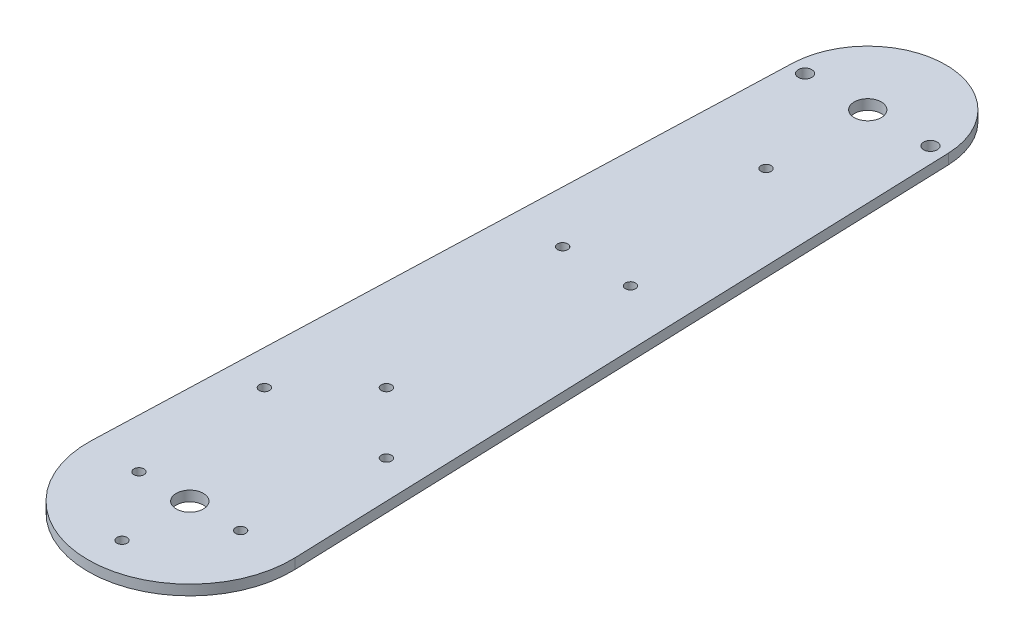
ISO-10303-21;
HEADER;
FILE_DESCRIPTION(('STEP AP214'),'2;1');
FILE_NAME('part.step','',(''),(''),'','','');
FILE_SCHEMA(('AUTOMOTIVE_DESIGN { 1 0 10303 214 1 1 1 1 }'));
ENDSEC;
DATA;
#1=APPLICATION_CONTEXT('core data for automotive mechanical design processes');
#2=APPLICATION_PROTOCOL_DEFINITION('international standard','automotive_design',2000,#1);
#3=PRODUCT_CONTEXT('',#1,'mechanical');
#4=PRODUCT('Part','Part','',(#3));
#5=PRODUCT_RELATED_PRODUCT_CATEGORY('part','',(#4));
#6=PRODUCT_DEFINITION_FORMATION('','',#4);
#7=PRODUCT_DEFINITION_CONTEXT('part definition',#1,'design');
#8=PRODUCT_DEFINITION('design','',#6,#7);
#9=PRODUCT_DEFINITION_SHAPE('','',#8);
#10=(LENGTH_UNIT() NAMED_UNIT(*) SI_UNIT(.MILLI.,.METRE.));
#11=(NAMED_UNIT(*) PLANE_ANGLE_UNIT() SI_UNIT($,.RADIAN.));
#12=(NAMED_UNIT(*) SI_UNIT($,.STERADIAN.) SOLID_ANGLE_UNIT());
#13=UNCERTAINTY_MEASURE_WITH_UNIT(LENGTH_MEASURE(1.E-05),#10,'distance_accuracy_value','');
#14=(GEOMETRIC_REPRESENTATION_CONTEXT(3) GLOBAL_UNCERTAINTY_ASSIGNED_CONTEXT((#13)) GLOBAL_UNIT_ASSIGNED_CONTEXT((#10,
#11,#12)) REPRESENTATION_CONTEXT('',''));
#15=CARTESIAN_POINT('',(0.,0.,0.));
#16=DIRECTION('',(0.,0.,1.));
#17=DIRECTION('',(1.,0.,0.));
#18=AXIS2_PLACEMENT_3D('',#15,#16,#17);
#19=CARTESIAN_POINT('',(0.,-3.,-200.));
#20=DIRECTION('',(0.,1.,0.));
#21=DIRECTION('',(0.,0.,1.));
#22=AXIS2_PLACEMENT_3D('',#19,#20,#21);
#23=CYLINDRICAL_SURFACE('',#22,23.);
#24=CARTESIAN_POINT('',(0.,0.,-200.));
#25=DIRECTION('',(0.,1.,0.));
#26=DIRECTION('',(0.,0.,1.));
#27=AXIS2_PLACEMENT_3D('',#24,#25,#26);
#28=CIRCLE('',#27,23.);
#29=CARTESIAN_POINT('',(22.9859081830586,0.,-200.805));
#30=VERTEX_POINT('',#29);
#31=CARTESIAN_POINT('',(-22.9859081830586,0.,-200.805));
#32=VERTEX_POINT('',#31);
#33=EDGE_CURVE('E101',#30,#32,#28,.T.);
#34=ORIENTED_EDGE('',*,*,#33,.F.);
#35=DIRECTION('',(0.,1.,0.));
#36=VECTOR('',#35,1.);
#37=CARTESIAN_POINT('',(22.9859081830586,-3.,-200.805));
#38=LINE('',#37,#36);
#39=CARTESIAN_POINT('',(22.9859081830586,-3.,-200.805));
#40=VERTEX_POINT('',#39);
#41=EDGE_CURVE('E11',#40,#30,#38,.T.);
#42=ORIENTED_EDGE('',*,*,#41,.F.);
#43=CARTESIAN_POINT('',(0.,-3.,-200.));
#44=DIRECTION('',(0.,1.,0.));
#45=DIRECTION('',(0.,0.,1.));
#46=AXIS2_PLACEMENT_3D('',#43,#44,#45);
#47=CIRCLE('',#46,23.);
#48=CARTESIAN_POINT('',(-22.9859081830586,-3.,-200.805));
#49=VERTEX_POINT('',#48);
#50=EDGE_CURVE('E94',#40,#49,#47,.T.);
#51=ORIENTED_EDGE('',*,*,#50,.T.);
#52=DIRECTION('',(0.,1.,0.));
#53=VECTOR('',#52,1.);
#54=CARTESIAN_POINT('',(-22.9859081830586,-3.,-200.805));
#55=LINE('',#54,#53);
#56=EDGE_CURVE('E39',#49,#32,#55,.T.);
#57=ORIENTED_EDGE('',*,*,#56,.T.);
#58=EDGE_LOOP('',(#34,#42,#51,#57));
#59=FACE_BOUND('',#58,.T.);
#60=ADVANCED_FACE('F36',(#59),#23,.T.);
#61=CARTESIAN_POINT('',(22.9859081830586,-3.,-200.805));
#62=DIRECTION('',(0.999387312306895,0.,-0.035));
#63=DIRECTION('',(-0.035,0.,-0.999387312306895));
#64=AXIS2_PLACEMENT_3D('',#61,#62,#63);
#65=PLANE('',#64);
#66=DIRECTION('',(-0.035,0.,-0.999387312306895));
#67=VECTOR('',#66,1.);
#68=CARTESIAN_POINT('',(22.9859081830586,0.,-200.805));
#69=LINE('',#68,#67);
#70=CARTESIAN_POINT('',(29.9816193692069,0.,-1.05));
#71=VERTEX_POINT('',#70);
#72=EDGE_CURVE('E96',#71,#30,#69,.T.);
#73=ORIENTED_EDGE('',*,*,#72,.F.);
#74=DIRECTION('',(0.,1.,0.));
#75=VECTOR('',#74,1.);
#76=CARTESIAN_POINT('',(29.9816193692069,-3.,-1.05));
#77=LINE('',#76,#75);
#78=CARTESIAN_POINT('',(29.9816193692069,-3.,-1.05));
#79=VERTEX_POINT('',#78);
#80=EDGE_CURVE('E45',#79,#71,#77,.T.);
#81=ORIENTED_EDGE('',*,*,#80,.F.);
#82=DIRECTION('',(-0.035,0.,-0.999387312306895));
#83=VECTOR('',#82,1.);
#84=CARTESIAN_POINT('',(22.9859081830586,-3.,-200.805));
#85=LINE('',#84,#83);
#86=EDGE_CURVE('E91',#79,#40,#85,.T.);
#87=ORIENTED_EDGE('',*,*,#86,.T.);
#88=ORIENTED_EDGE('',*,*,#41,.T.);
#89=EDGE_LOOP('',(#73,#81,#87,#88));
#90=FACE_BOUND('',#89,.T.);
#91=ADVANCED_FACE('F112',(#90),#65,.T.);
#92=CARTESIAN_POINT('',(0.,-3.,0.));
#93=DIRECTION('',(0.,1.,0.));
#94=DIRECTION('',(0.,0.,1.));
#95=AXIS2_PLACEMENT_3D('',#92,#93,#94);
#96=CYLINDRICAL_SURFACE('',#95,30.);
#97=CARTESIAN_POINT('',(0.,0.,0.));
#98=DIRECTION('',(0.,1.,0.));
#99=DIRECTION('',(0.,0.,1.));
#100=AXIS2_PLACEMENT_3D('',#97,#98,#99);
#101=CIRCLE('',#100,30.);
#102=CARTESIAN_POINT('',(-29.9816193692069,0.,-1.05000000000001));
#103=VERTEX_POINT('',#102);
#104=EDGE_CURVE('E86',#103,#71,#101,.T.);
#105=ORIENTED_EDGE('',*,*,#104,.F.);
#106=DIRECTION('',(0.,1.,0.));
#107=VECTOR('',#106,1.);
#108=CARTESIAN_POINT('',(-29.9816193692069,-3.,-1.05000000000001));
#109=LINE('',#108,#107);
#110=CARTESIAN_POINT('',(-29.9816193692069,-3.,-1.05000000000001));
#111=VERTEX_POINT('',#110);
#112=EDGE_CURVE('E81',#111,#103,#109,.T.);
#113=ORIENTED_EDGE('',*,*,#112,.F.);
#114=CARTESIAN_POINT('',(0.,-3.,0.));
#115=DIRECTION('',(0.,1.,0.));
#116=DIRECTION('',(0.,0.,1.));
#117=AXIS2_PLACEMENT_3D('',#114,#115,#116);
#118=CIRCLE('',#117,30.);
#119=EDGE_CURVE('E84',#111,#79,#118,.T.);
#120=ORIENTED_EDGE('',*,*,#119,.T.);
#121=ORIENTED_EDGE('',*,*,#80,.T.);
#122=EDGE_LOOP('',(#105,#113,#120,#121));
#123=FACE_BOUND('',#122,.T.);
#124=ADVANCED_FACE('F83',(#123),#96,.T.);
#125=CARTESIAN_POINT('',(-22.9859081830586,-3.,-200.805));
#126=DIRECTION('',(-0.999387312306895,0.,-0.035));
#127=DIRECTION('',(-0.035,0.,0.999387312306895));
#128=AXIS2_PLACEMENT_3D('',#125,#126,#127);
#129=PLANE('',#128);
#130=DIRECTION('',(-0.035,0.,0.999387312306895));
#131=VECTOR('',#130,1.);
#132=CARTESIAN_POINT('',(-22.9859081830586,0.,-200.805));
#133=LINE('',#132,#131);
#134=EDGE_CURVE('E104',#32,#103,#133,.T.);
#135=ORIENTED_EDGE('',*,*,#134,.F.);
#136=ORIENTED_EDGE('',*,*,#56,.F.);
#137=DIRECTION('',(-0.035,0.,0.999387312306895));
#138=VECTOR('',#137,1.);
#139=CARTESIAN_POINT('',(-22.9859081830586,-3.,-200.805));
#140=LINE('',#139,#138);
#141=EDGE_CURVE('E90',#49,#111,#140,.T.);
#142=ORIENTED_EDGE('',*,*,#141,.T.);
#143=ORIENTED_EDGE('',*,*,#112,.T.);
#144=EDGE_LOOP('',(#135,#136,#142,#143));
#145=FACE_BOUND('',#144,.T.);
#146=ADVANCED_FACE('F93',(#145),#129,.T.);
#147=CARTESIAN_POINT('',(0.,-3.,-200.));
#148=DIRECTION('',(0.,1.,0.));
#149=DIRECTION('',(0.,0.,1.));
#150=AXIS2_PLACEMENT_3D('',#147,#148,#149);
#151=PLANE('',#150);
#152=CARTESIAN_POINT('',(15.,-3.,0.));
#153=DIRECTION('',(0.,1.,0.));
#154=DIRECTION('',(0.,0.,1.));
#155=AXIS2_PLACEMENT_3D('',#152,#153,#154);
#156=CIRCLE('',#155,1.5);
#157=CARTESIAN_POINT('',(15.,-3.,1.5));
#158=VERTEX_POINT('',#157);
#159=EDGE_CURVE('E189',#158,#158,#156,.T.);
#160=ORIENTED_EDGE('',*,*,#159,.T.);
#161=EDGE_LOOP('',(#160));
#162=FACE_BOUND('',#161,.T.);
#163=CARTESIAN_POINT('',(-15.,-3.,0.));
#164=DIRECTION('',(0.,1.,0.));
#165=DIRECTION('',(0.,0.,1.));
#166=AXIS2_PLACEMENT_3D('',#163,#164,#165);
#167=CIRCLE('',#166,1.5);
#168=CARTESIAN_POINT('',(-15.,-3.,1.5));
#169=VERTEX_POINT('',#168);
#170=EDGE_CURVE('E197',#169,#169,#167,.T.);
#171=ORIENTED_EDGE('',*,*,#170,.T.);
#172=EDGE_LOOP('',(#171));
#173=FACE_BOUND('',#172,.T.);
#174=CARTESIAN_POINT('',(0.,-3.,-58.));
#175=DIRECTION('',(0.,1.,0.));
#176=DIRECTION('',(0.,0.,1.));
#177=AXIS2_PLACEMENT_3D('',#174,#175,#176);
#178=CIRCLE('',#177,1.5);
#179=CARTESIAN_POINT('',(0.,-3.,-56.5));
#180=VERTEX_POINT('',#179);
#181=EDGE_CURVE('E203',#180,#180,#178,.T.);
#182=ORIENTED_EDGE('',*,*,#181,.T.);
#183=EDGE_LOOP('',(#182));
#184=FACE_BOUND('',#183,.T.);
#185=CARTESIAN_POINT('',(18.5,-3.,-200.));
#186=DIRECTION('',(0.,1.,0.));
#187=DIRECTION('',(0.,0.,1.));
#188=AXIS2_PLACEMENT_3D('',#185,#186,#187);
#189=CIRCLE('',#188,2.);
#190=CARTESIAN_POINT('',(18.5,-3.,-198.));
#191=VERTEX_POINT('',#190);
#192=EDGE_CURVE('E209',#191,#191,#189,.T.);
#193=ORIENTED_EDGE('',*,*,#192,.T.);
#194=EDGE_LOOP('',(#193));
#195=FACE_BOUND('',#194,.T.);
#196=CARTESIAN_POINT('',(8.49589665914252E-13,-3.,20.));
#197=DIRECTION('',(0.,1.,0.));
#198=DIRECTION('',(0.,0.,1.));
#199=AXIS2_PLACEMENT_3D('',#196,#197,#198);
#200=CIRCLE('',#199,1.5);
#201=CARTESIAN_POINT('',(8.49589665914252E-13,-3.,21.5));
#202=VERTEX_POINT('',#201);
#203=EDGE_CURVE('E215',#202,#202,#200,.T.);
#204=ORIENTED_EDGE('',*,*,#203,.T.);
#205=EDGE_LOOP('',(#204));
#206=FACE_BOUND('',#205,.T.);
#207=CARTESIAN_POINT('',(-18.5,-3.,-200.));
#208=DIRECTION('',(0.,1.,0.));
#209=DIRECTION('',(0.,0.,1.));
#210=AXIS2_PLACEMENT_3D('',#207,#208,#209);
#211=CIRCLE('',#210,2.);
#212=CARTESIAN_POINT('',(-18.5,-3.,-198.));
#213=VERTEX_POINT('',#212);
#214=EDGE_CURVE('E221',#213,#213,#211,.T.);
#215=ORIENTED_EDGE('',*,*,#214,.T.);
#216=EDGE_LOOP('',(#215));
#217=FACE_BOUND('',#216,.T.);
#218=CARTESIAN_POINT('',(0.,-3.,-170.));
#219=DIRECTION('',(0.,1.,0.));
#220=DIRECTION('',(0.,0.,1.));
#221=AXIS2_PLACEMENT_3D('',#218,#219,#220);
#222=CIRCLE('',#221,1.5);
#223=CARTESIAN_POINT('',(0.,-3.,-168.5));
#224=VERTEX_POINT('',#223);
#225=EDGE_CURVE('E227',#224,#224,#222,.T.);
#226=ORIENTED_EDGE('',*,*,#225,.T.);
#227=EDGE_LOOP('',(#226));
#228=FACE_BOUND('',#227,.T.);
#229=CARTESIAN_POINT('',(-18.,-3.,-40.));
#230=DIRECTION('',(0.,1.,0.));
#231=DIRECTION('',(0.,0.,1.));
#232=AXIS2_PLACEMENT_3D('',#229,#230,#231);
#233=CIRCLE('',#232,1.5);
#234=CARTESIAN_POINT('',(-18.,-3.,-38.5));
#235=VERTEX_POINT('',#234);
#236=EDGE_CURVE('E233',#235,#235,#233,.T.);
#237=ORIENTED_EDGE('',*,*,#236,.T.);
#238=EDGE_LOOP('',(#237));
#239=FACE_BOUND('',#238,.T.);
#240=CARTESIAN_POINT('',(18.,-3.,-40.));
#241=DIRECTION('',(0.,1.,0.));
#242=DIRECTION('',(0.,0.,1.));
#243=AXIS2_PLACEMENT_3D('',#240,#241,#242);
#244=CIRCLE('',#243,1.5);
#245=CARTESIAN_POINT('',(18.,-3.,-38.5));
#246=VERTEX_POINT('',#245);
#247=EDGE_CURVE('E239',#246,#246,#244,.T.);
#248=ORIENTED_EDGE('',*,*,#247,.T.);
#249=EDGE_LOOP('',(#248));
#250=FACE_BOUND('',#249,.T.);
#251=CARTESIAN_POINT('',(-10.,-3.,-120.));
#252=DIRECTION('',(0.,1.,0.));
#253=DIRECTION('',(0.,0.,1.));
#254=AXIS2_PLACEMENT_3D('',#251,#252,#253);
#255=CIRCLE('',#254,1.5);
#256=CARTESIAN_POINT('',(-10.,-3.,-118.5));
#257=VERTEX_POINT('',#256);
#258=EDGE_CURVE('E245',#257,#257,#255,.T.);
#259=ORIENTED_EDGE('',*,*,#258,.T.);
#260=EDGE_LOOP('',(#259));
#261=FACE_BOUND('',#260,.T.);
#262=CARTESIAN_POINT('',(10.,-3.,-120.));
#263=DIRECTION('',(0.,1.,0.));
#264=DIRECTION('',(0.,0.,1.));
#265=AXIS2_PLACEMENT_3D('',#262,#263,#264);
#266=CIRCLE('',#265,1.5);
#267=CARTESIAN_POINT('',(10.,-3.,-118.5));
#268=VERTEX_POINT('',#267);
#269=EDGE_CURVE('E251',#268,#268,#266,.T.);
#270=ORIENTED_EDGE('',*,*,#269,.T.);
#271=EDGE_LOOP('',(#270));
#272=FACE_BOUND('',#271,.T.);
#273=CARTESIAN_POINT('',(0.,-3.,-200.));
#274=DIRECTION('',(0.,1.,0.));
#275=DIRECTION('',(0.,0.,1.));
#276=AXIS2_PLACEMENT_3D('',#273,#274,#275);
#277=CIRCLE('',#276,4.);
#278=CARTESIAN_POINT('',(0.,-3.,-196.));
#279=VERTEX_POINT('',#278);
#280=EDGE_CURVE('E257',#279,#279,#277,.T.);
#281=ORIENTED_EDGE('',*,*,#280,.T.);
#282=EDGE_LOOP('',(#281));
#283=FACE_BOUND('',#282,.T.);
#284=CARTESIAN_POINT('',(0.,-3.,0.));
#285=DIRECTION('',(0.,1.,0.));
#286=DIRECTION('',(0.,0.,1.));
#287=AXIS2_PLACEMENT_3D('',#284,#285,#286);
#288=CIRCLE('',#287,4.);
#289=CARTESIAN_POINT('',(0.,-3.,4.));
#290=VERTEX_POINT('',#289);
#291=EDGE_CURVE('E105',#290,#290,#288,.T.);
#292=ORIENTED_EDGE('',*,*,#291,.T.);
#293=EDGE_LOOP('',(#292));
#294=FACE_BOUND('',#293,.T.);
#295=ORIENTED_EDGE('',*,*,#50,.F.);
#296=ORIENTED_EDGE('',*,*,#86,.F.);
#297=ORIENTED_EDGE('',*,*,#119,.F.);
#298=ORIENTED_EDGE('',*,*,#141,.F.);
#299=EDGE_LOOP('',(#295,#296,#297,#298));
#300=FACE_BOUND('',#299,.T.);
#301=ADVANCED_FACE('F89',(#162,#173,#184,#195,#206,#217,#228,#239,#250,#261,#272,#283,#294,
#300),#151,.F.);
#302=CARTESIAN_POINT('',(0.,0.,-200.));
#303=DIRECTION('',(0.,1.,0.));
#304=DIRECTION('',(0.,0.,1.));
#305=AXIS2_PLACEMENT_3D('',#302,#303,#304);
#306=PLANE('',#305);
#307=CARTESIAN_POINT('',(15.,0.,0.));
#308=DIRECTION('',(0.,1.,0.));
#309=DIRECTION('',(0.,0.,1.));
#310=AXIS2_PLACEMENT_3D('',#307,#308,#309);
#311=CIRCLE('',#310,1.5);
#312=CARTESIAN_POINT('',(15.,0.,1.5));
#313=VERTEX_POINT('',#312);
#314=EDGE_CURVE('E192',#313,#313,#311,.T.);
#315=ORIENTED_EDGE('',*,*,#314,.F.);
#316=EDGE_LOOP('',(#315));
#317=FACE_BOUND('',#316,.T.);
#318=CARTESIAN_POINT('',(-15.,0.,0.));
#319=DIRECTION('',(0.,1.,0.));
#320=DIRECTION('',(0.,0.,1.));
#321=AXIS2_PLACEMENT_3D('',#318,#319,#320);
#322=CIRCLE('',#321,1.5);
#323=CARTESIAN_POINT('',(-15.,0.,1.5));
#324=VERTEX_POINT('',#323);
#325=EDGE_CURVE('E194',#324,#324,#322,.T.);
#326=ORIENTED_EDGE('',*,*,#325,.F.);
#327=EDGE_LOOP('',(#326));
#328=FACE_BOUND('',#327,.T.);
#329=CARTESIAN_POINT('',(0.,0.,-58.));
#330=DIRECTION('',(0.,1.,0.));
#331=DIRECTION('',(0.,0.,1.));
#332=AXIS2_PLACEMENT_3D('',#329,#330,#331);
#333=CIRCLE('',#332,1.5);
#334=CARTESIAN_POINT('',(0.,0.,-56.5));
#335=VERTEX_POINT('',#334);
#336=EDGE_CURVE('E200',#335,#335,#333,.T.);
#337=ORIENTED_EDGE('',*,*,#336,.F.);
#338=EDGE_LOOP('',(#337));
#339=FACE_BOUND('',#338,.T.);
#340=CARTESIAN_POINT('',(18.5,0.,-200.));
#341=DIRECTION('',(0.,1.,0.));
#342=DIRECTION('',(0.,0.,1.));
#343=AXIS2_PLACEMENT_3D('',#340,#341,#342);
#344=CIRCLE('',#343,2.);
#345=CARTESIAN_POINT('',(18.5,0.,-198.));
#346=VERTEX_POINT('',#345);
#347=EDGE_CURVE('E206',#346,#346,#344,.T.);
#348=ORIENTED_EDGE('',*,*,#347,.F.);
#349=EDGE_LOOP('',(#348));
#350=FACE_BOUND('',#349,.T.);
#351=CARTESIAN_POINT('',(8.49589665914252E-13,0.,20.));
#352=DIRECTION('',(0.,1.,0.));
#353=DIRECTION('',(0.,0.,1.));
#354=AXIS2_PLACEMENT_3D('',#351,#352,#353);
#355=CIRCLE('',#354,1.5);
#356=CARTESIAN_POINT('',(8.49589665914252E-13,0.,21.5));
#357=VERTEX_POINT('',#356);
#358=EDGE_CURVE('E212',#357,#357,#355,.T.);
#359=ORIENTED_EDGE('',*,*,#358,.F.);
#360=EDGE_LOOP('',(#359));
#361=FACE_BOUND('',#360,.T.);
#362=CARTESIAN_POINT('',(-18.5,0.,-200.));
#363=DIRECTION('',(0.,1.,0.));
#364=DIRECTION('',(0.,0.,1.));
#365=AXIS2_PLACEMENT_3D('',#362,#363,#364);
#366=CIRCLE('',#365,2.);
#367=CARTESIAN_POINT('',(-18.5,0.,-198.));
#368=VERTEX_POINT('',#367);
#369=EDGE_CURVE('E218',#368,#368,#366,.T.);
#370=ORIENTED_EDGE('',*,*,#369,.F.);
#371=EDGE_LOOP('',(#370));
#372=FACE_BOUND('',#371,.T.);
#373=CARTESIAN_POINT('',(0.,0.,-170.));
#374=DIRECTION('',(0.,1.,0.));
#375=DIRECTION('',(0.,0.,1.));
#376=AXIS2_PLACEMENT_3D('',#373,#374,#375);
#377=CIRCLE('',#376,1.5);
#378=CARTESIAN_POINT('',(0.,0.,-168.5));
#379=VERTEX_POINT('',#378);
#380=EDGE_CURVE('E224',#379,#379,#377,.T.);
#381=ORIENTED_EDGE('',*,*,#380,.F.);
#382=EDGE_LOOP('',(#381));
#383=FACE_BOUND('',#382,.T.);
#384=CARTESIAN_POINT('',(-18.,0.,-40.));
#385=DIRECTION('',(0.,1.,0.));
#386=DIRECTION('',(0.,0.,1.));
#387=AXIS2_PLACEMENT_3D('',#384,#385,#386);
#388=CIRCLE('',#387,1.5);
#389=CARTESIAN_POINT('',(-18.,0.,-38.5));
#390=VERTEX_POINT('',#389);
#391=EDGE_CURVE('E230',#390,#390,#388,.T.);
#392=ORIENTED_EDGE('',*,*,#391,.F.);
#393=EDGE_LOOP('',(#392));
#394=FACE_BOUND('',#393,.T.);
#395=CARTESIAN_POINT('',(18.,0.,-40.));
#396=DIRECTION('',(0.,1.,0.));
#397=DIRECTION('',(0.,0.,1.));
#398=AXIS2_PLACEMENT_3D('',#395,#396,#397);
#399=CIRCLE('',#398,1.5);
#400=CARTESIAN_POINT('',(18.,0.,-38.5));
#401=VERTEX_POINT('',#400);
#402=EDGE_CURVE('E236',#401,#401,#399,.T.);
#403=ORIENTED_EDGE('',*,*,#402,.F.);
#404=EDGE_LOOP('',(#403));
#405=FACE_BOUND('',#404,.T.);
#406=CARTESIAN_POINT('',(-10.,0.,-120.));
#407=DIRECTION('',(0.,1.,0.));
#408=DIRECTION('',(0.,0.,1.));
#409=AXIS2_PLACEMENT_3D('',#406,#407,#408);
#410=CIRCLE('',#409,1.5);
#411=CARTESIAN_POINT('',(-10.,0.,-118.5));
#412=VERTEX_POINT('',#411);
#413=EDGE_CURVE('E242',#412,#412,#410,.T.);
#414=ORIENTED_EDGE('',*,*,#413,.F.);
#415=EDGE_LOOP('',(#414));
#416=FACE_BOUND('',#415,.T.);
#417=CARTESIAN_POINT('',(10.,0.,-120.));
#418=DIRECTION('',(0.,1.,0.));
#419=DIRECTION('',(0.,0.,1.));
#420=AXIS2_PLACEMENT_3D('',#417,#418,#419);
#421=CIRCLE('',#420,1.5);
#422=CARTESIAN_POINT('',(10.,0.,-118.5));
#423=VERTEX_POINT('',#422);
#424=EDGE_CURVE('E248',#423,#423,#421,.T.);
#425=ORIENTED_EDGE('',*,*,#424,.F.);
#426=EDGE_LOOP('',(#425));
#427=FACE_BOUND('',#426,.T.);
#428=CARTESIAN_POINT('',(0.,0.,-200.));
#429=DIRECTION('',(0.,1.,0.));
#430=DIRECTION('',(0.,0.,1.));
#431=AXIS2_PLACEMENT_3D('',#428,#429,#430);
#432=CIRCLE('',#431,4.);
#433=CARTESIAN_POINT('',(0.,0.,-196.));
#434=VERTEX_POINT('',#433);
#435=EDGE_CURVE('E254',#434,#434,#432,.T.);
#436=ORIENTED_EDGE('',*,*,#435,.F.);
#437=EDGE_LOOP('',(#436));
#438=FACE_BOUND('',#437,.T.);
#439=CARTESIAN_POINT('',(0.,0.,0.));
#440=DIRECTION('',(0.,1.,0.));
#441=DIRECTION('',(0.,0.,1.));
#442=AXIS2_PLACEMENT_3D('',#439,#440,#441);
#443=CIRCLE('',#442,4.);
#444=CARTESIAN_POINT('',(0.,0.,4.));
#445=VERTEX_POINT('',#444);
#446=EDGE_CURVE('E260',#445,#445,#443,.T.);
#447=ORIENTED_EDGE('',*,*,#446,.F.);
#448=EDGE_LOOP('',(#447));
#449=FACE_BOUND('',#448,.T.);
#450=ORIENTED_EDGE('',*,*,#33,.T.);
#451=ORIENTED_EDGE('',*,*,#134,.T.);
#452=ORIENTED_EDGE('',*,*,#104,.T.);
#453=ORIENTED_EDGE('',*,*,#72,.T.);
#454=EDGE_LOOP('',(#450,#451,#452,#453));
#455=FACE_BOUND('',#454,.T.);
#456=ADVANCED_FACE('F111',(#317,#328,#339,#350,#361,#372,#383,#394,#405,#416,#427,#438,#449,
#455),#306,.T.);
#457=CARTESIAN_POINT('',(0.,-3.,0.));
#458=DIRECTION('',(0.,1.,0.));
#459=DIRECTION('',(0.,0.,1.));
#460=AXIS2_PLACEMENT_3D('',#457,#458,#459);
#461=CYLINDRICAL_SURFACE('',#460,4.);
#462=ORIENTED_EDGE('',*,*,#291,.F.);
#463=EDGE_LOOP('',(#462));
#464=FACE_BOUND('',#463,.T.);
#465=ORIENTED_EDGE('',*,*,#446,.T.);
#466=EDGE_LOOP('',(#465));
#467=FACE_BOUND('',#466,.T.);
#468=ADVANCED_FACE('F130',(#464,#467),#461,.F.);
#469=CARTESIAN_POINT('',(0.,-3.,-200.));
#470=DIRECTION('',(0.,1.,0.));
#471=DIRECTION('',(0.,0.,1.));
#472=AXIS2_PLACEMENT_3D('',#469,#470,#471);
#473=CYLINDRICAL_SURFACE('',#472,4.);
#474=ORIENTED_EDGE('',*,*,#280,.F.);
#475=EDGE_LOOP('',(#474));
#476=FACE_BOUND('',#475,.T.);
#477=ORIENTED_EDGE('',*,*,#435,.T.);
#478=EDGE_LOOP('',(#477));
#479=FACE_BOUND('',#478,.T.);
#480=ADVANCED_FACE('F137',(#476,#479),#473,.F.);
#481=CARTESIAN_POINT('',(10.,-3.,-120.));
#482=DIRECTION('',(0.,1.,0.));
#483=DIRECTION('',(0.,0.,1.));
#484=AXIS2_PLACEMENT_3D('',#481,#482,#483);
#485=CYLINDRICAL_SURFACE('',#484,1.5);
#486=ORIENTED_EDGE('',*,*,#269,.F.);
#487=EDGE_LOOP('',(#486));
#488=FACE_BOUND('',#487,.T.);
#489=ORIENTED_EDGE('',*,*,#424,.T.);
#490=EDGE_LOOP('',(#489));
#491=FACE_BOUND('',#490,.T.);
#492=ADVANCED_FACE('F141',(#488,#491),#485,.F.);
#493=CARTESIAN_POINT('',(-10.,-3.,-120.));
#494=DIRECTION('',(0.,1.,0.));
#495=DIRECTION('',(0.,0.,1.));
#496=AXIS2_PLACEMENT_3D('',#493,#494,#495);
#497=CYLINDRICAL_SURFACE('',#496,1.5);
#498=ORIENTED_EDGE('',*,*,#258,.F.);
#499=EDGE_LOOP('',(#498));
#500=FACE_BOUND('',#499,.T.);
#501=ORIENTED_EDGE('',*,*,#413,.T.);
#502=EDGE_LOOP('',(#501));
#503=FACE_BOUND('',#502,.T.);
#504=ADVANCED_FACE('F145',(#500,#503),#497,.F.);
#505=CARTESIAN_POINT('',(18.,-3.,-40.));
#506=DIRECTION('',(0.,1.,0.));
#507=DIRECTION('',(0.,0.,1.));
#508=AXIS2_PLACEMENT_3D('',#505,#506,#507);
#509=CYLINDRICAL_SURFACE('',#508,1.5);
#510=ORIENTED_EDGE('',*,*,#247,.F.);
#511=EDGE_LOOP('',(#510));
#512=FACE_BOUND('',#511,.T.);
#513=ORIENTED_EDGE('',*,*,#402,.T.);
#514=EDGE_LOOP('',(#513));
#515=FACE_BOUND('',#514,.T.);
#516=ADVANCED_FACE('F149',(#512,#515),#509,.F.);
#517=CARTESIAN_POINT('',(-18.,-3.,-40.));
#518=DIRECTION('',(0.,1.,0.));
#519=DIRECTION('',(0.,0.,1.));
#520=AXIS2_PLACEMENT_3D('',#517,#518,#519);
#521=CYLINDRICAL_SURFACE('',#520,1.5);
#522=ORIENTED_EDGE('',*,*,#236,.F.);
#523=EDGE_LOOP('',(#522));
#524=FACE_BOUND('',#523,.T.);
#525=ORIENTED_EDGE('',*,*,#391,.T.);
#526=EDGE_LOOP('',(#525));
#527=FACE_BOUND('',#526,.T.);
#528=ADVANCED_FACE('F153',(#524,#527),#521,.F.);
#529=CARTESIAN_POINT('',(0.,-3.,-170.));
#530=DIRECTION('',(0.,1.,0.));
#531=DIRECTION('',(0.,0.,1.));
#532=AXIS2_PLACEMENT_3D('',#529,#530,#531);
#533=CYLINDRICAL_SURFACE('',#532,1.5);
#534=ORIENTED_EDGE('',*,*,#225,.F.);
#535=EDGE_LOOP('',(#534));
#536=FACE_BOUND('',#535,.T.);
#537=ORIENTED_EDGE('',*,*,#380,.T.);
#538=EDGE_LOOP('',(#537));
#539=FACE_BOUND('',#538,.T.);
#540=ADVANCED_FACE('F157',(#536,#539),#533,.F.);
#541=CARTESIAN_POINT('',(-18.5,-3.,-200.));
#542=DIRECTION('',(0.,1.,0.));
#543=DIRECTION('',(0.,0.,1.));
#544=AXIS2_PLACEMENT_3D('',#541,#542,#543);
#545=CYLINDRICAL_SURFACE('',#544,2.);
#546=ORIENTED_EDGE('',*,*,#214,.F.);
#547=EDGE_LOOP('',(#546));
#548=FACE_BOUND('',#547,.T.);
#549=ORIENTED_EDGE('',*,*,#369,.T.);
#550=EDGE_LOOP('',(#549));
#551=FACE_BOUND('',#550,.T.);
#552=ADVANCED_FACE('F161',(#548,#551),#545,.F.);
#553=CARTESIAN_POINT('',(8.49589665914252E-13,-3.,20.));
#554=DIRECTION('',(0.,1.,0.));
#555=DIRECTION('',(0.,0.,1.));
#556=AXIS2_PLACEMENT_3D('',#553,#554,#555);
#557=CYLINDRICAL_SURFACE('',#556,1.5);
#558=ORIENTED_EDGE('',*,*,#203,.F.);
#559=EDGE_LOOP('',(#558));
#560=FACE_BOUND('',#559,.T.);
#561=ORIENTED_EDGE('',*,*,#358,.T.);
#562=EDGE_LOOP('',(#561));
#563=FACE_BOUND('',#562,.T.);
#564=ADVANCED_FACE('F165',(#560,#563),#557,.F.);
#565=CARTESIAN_POINT('',(18.5,-3.,-200.));
#566=DIRECTION('',(0.,1.,0.));
#567=DIRECTION('',(0.,0.,1.));
#568=AXIS2_PLACEMENT_3D('',#565,#566,#567);
#569=CYLINDRICAL_SURFACE('',#568,2.);
#570=ORIENTED_EDGE('',*,*,#192,.F.);
#571=EDGE_LOOP('',(#570));
#572=FACE_BOUND('',#571,.T.);
#573=ORIENTED_EDGE('',*,*,#347,.T.);
#574=EDGE_LOOP('',(#573));
#575=FACE_BOUND('',#574,.T.);
#576=ADVANCED_FACE('F169',(#572,#575),#569,.F.);
#577=CARTESIAN_POINT('',(0.,-3.,-58.));
#578=DIRECTION('',(0.,1.,0.));
#579=DIRECTION('',(0.,0.,1.));
#580=AXIS2_PLACEMENT_3D('',#577,#578,#579);
#581=CYLINDRICAL_SURFACE('',#580,1.5);
#582=ORIENTED_EDGE('',*,*,#181,.F.);
#583=EDGE_LOOP('',(#582));
#584=FACE_BOUND('',#583,.T.);
#585=ORIENTED_EDGE('',*,*,#336,.T.);
#586=EDGE_LOOP('',(#585));
#587=FACE_BOUND('',#586,.T.);
#588=ADVANCED_FACE('F173',(#584,#587),#581,.F.);
#589=CARTESIAN_POINT('',(-15.,-3.,0.));
#590=DIRECTION('',(0.,1.,0.));
#591=DIRECTION('',(0.,0.,1.));
#592=AXIS2_PLACEMENT_3D('',#589,#590,#591);
#593=CYLINDRICAL_SURFACE('',#592,1.5);
#594=ORIENTED_EDGE('',*,*,#170,.F.);
#595=EDGE_LOOP('',(#594));
#596=FACE_BOUND('',#595,.T.);
#597=ORIENTED_EDGE('',*,*,#325,.T.);
#598=EDGE_LOOP('',(#597));
#599=FACE_BOUND('',#598,.T.);
#600=ADVANCED_FACE('F177',(#596,#599),#593,.F.);
#601=CARTESIAN_POINT('',(15.,-3.,0.));
#602=DIRECTION('',(0.,1.,0.));
#603=DIRECTION('',(0.,0.,1.));
#604=AXIS2_PLACEMENT_3D('',#601,#602,#603);
#605=CYLINDRICAL_SURFACE('',#604,1.5);
#606=ORIENTED_EDGE('',*,*,#159,.F.);
#607=EDGE_LOOP('',(#606));
#608=FACE_BOUND('',#607,.T.);
#609=ORIENTED_EDGE('',*,*,#314,.T.);
#610=EDGE_LOOP('',(#609));
#611=FACE_BOUND('',#610,.T.);
#612=ADVANCED_FACE('F181',(#608,#611),#605,.F.);
#613=CLOSED_SHELL('',(#60,#91,#124,#146,#301,#456,#468,#480,#492,#504,#516,#528,#540,#552,#564,
#576,#588,#600,#612));
#614=MANIFOLD_SOLID_BREP('B2',#613);
#615=ADVANCED_BREP_SHAPE_REPRESENTATION('',(#18,#614),#14);
#616=SHAPE_DEFINITION_REPRESENTATION(#9,#615);
ENDSEC;
END-ISO-10303-21;
